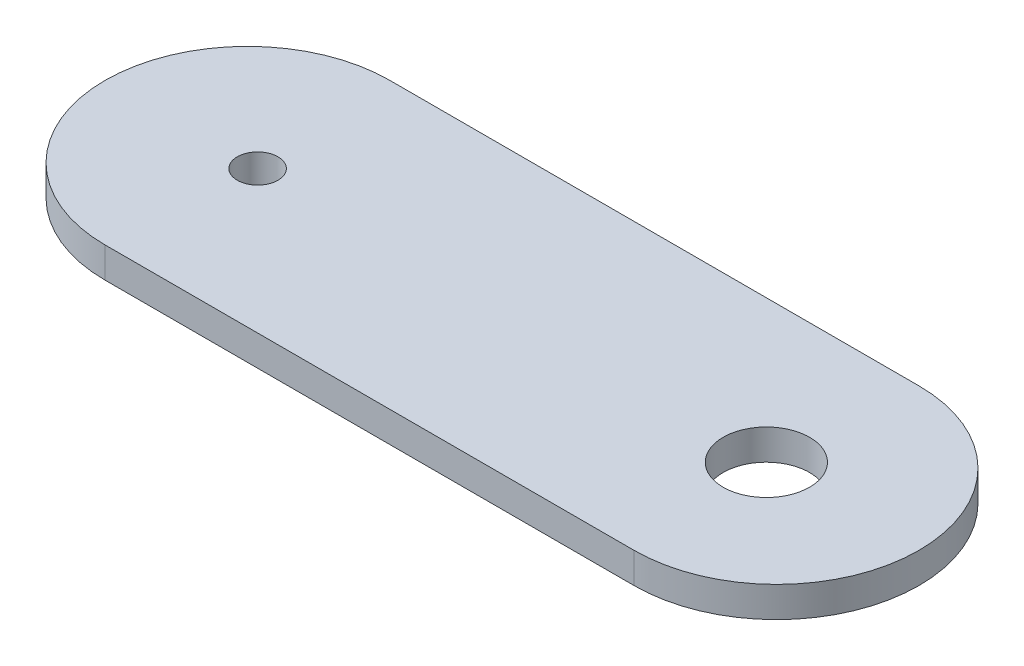
ISO-10303-21;
HEADER;
FILE_DESCRIPTION(('STEP AP214'),'2;1');
FILE_NAME('part.step','',(''),(''),'','','');
FILE_SCHEMA(('AUTOMOTIVE_DESIGN { 1 0 10303 214 1 1 1 1 }'));
ENDSEC;
DATA;
#1=APPLICATION_CONTEXT('core data for automotive mechanical design processes');
#2=APPLICATION_PROTOCOL_DEFINITION('international standard','automotive_design',2000,#1);
#3=PRODUCT_CONTEXT('',#1,'mechanical');
#4=PRODUCT('Part','Part','',(#3));
#5=PRODUCT_RELATED_PRODUCT_CATEGORY('part','',(#4));
#6=PRODUCT_DEFINITION_FORMATION('','',#4);
#7=PRODUCT_DEFINITION_CONTEXT('part definition',#1,'design');
#8=PRODUCT_DEFINITION('design','',#6,#7);
#9=PRODUCT_DEFINITION_SHAPE('','',#8);
#10=(LENGTH_UNIT() NAMED_UNIT(*) SI_UNIT(.MILLI.,.METRE.));
#11=(NAMED_UNIT(*) PLANE_ANGLE_UNIT() SI_UNIT($,.RADIAN.));
#12=(NAMED_UNIT(*) SI_UNIT($,.STERADIAN.) SOLID_ANGLE_UNIT());
#13=UNCERTAINTY_MEASURE_WITH_UNIT(LENGTH_MEASURE(1.E-05),#10,'distance_accuracy_value','');
#14=(GEOMETRIC_REPRESENTATION_CONTEXT(3) GLOBAL_UNCERTAINTY_ASSIGNED_CONTEXT((#13)) GLOBAL_UNIT_ASSIGNED_CONTEXT((#10,
#11,#12)) REPRESENTATION_CONTEXT('',''));
#15=CARTESIAN_POINT('',(0.,0.,0.));
#16=DIRECTION('',(0.,0.,1.));
#17=DIRECTION('',(1.,0.,0.));
#18=AXIS2_PLACEMENT_3D('',#15,#16,#17);
#19=CARTESIAN_POINT('',(26.,3.,0.));
#20=DIRECTION('',(0.,-1.,0.));
#21=DIRECTION('',(0.,0.,-1.));
#22=AXIS2_PLACEMENT_3D('',#19,#20,#21);
#23=CYLINDRICAL_SURFACE('',#22,14.);
#24=DIRECTION('',(0.,-1.,0.));
#25=VECTOR('',#24,1.);
#26=CARTESIAN_POINT('',(26.,3.,-14.));
#27=LINE('',#26,#25);
#28=CARTESIAN_POINT('',(26.,3.,-14.));
#29=VERTEX_POINT('',#28);
#30=CARTESIAN_POINT('',(26.,0.,-14.));
#31=VERTEX_POINT('',#30);
#32=EDGE_CURVE('E77',#29,#31,#27,.T.);
#33=ORIENTED_EDGE('',*,*,#32,.F.);
#34=CARTESIAN_POINT('',(26.,3.,0.));
#35=DIRECTION('',(0.,1.,0.));
#36=DIRECTION('',(0.,0.,1.));
#37=AXIS2_PLACEMENT_3D('',#34,#35,#36);
#38=CIRCLE('',#37,14.);
#39=CARTESIAN_POINT('',(26.,3.,14.));
#40=VERTEX_POINT('',#39);
#41=EDGE_CURVE('E40',#40,#29,#38,.T.);
#42=ORIENTED_EDGE('',*,*,#41,.F.);
#43=DIRECTION('',(0.,-1.,0.));
#44=VECTOR('',#43,1.);
#45=CARTESIAN_POINT('',(26.,3.,14.));
#46=LINE('',#45,#44);
#47=CARTESIAN_POINT('',(26.,0.,14.));
#48=VERTEX_POINT('',#47);
#49=EDGE_CURVE('E103',#48,#40,#46,.F.);
#50=ORIENTED_EDGE('',*,*,#49,.F.);
#51=CARTESIAN_POINT('',(26.,0.,0.));
#52=DIRECTION('',(0.,1.,0.));
#53=DIRECTION('',(0.,0.,1.));
#54=AXIS2_PLACEMENT_3D('',#51,#52,#53);
#55=CIRCLE('',#54,14.);
#56=EDGE_CURVE('E11',#31,#48,#55,.F.);
#57=ORIENTED_EDGE('',*,*,#56,.F.);
#58=EDGE_LOOP('',(#33,#42,#50,#57));
#59=FACE_BOUND('',#58,.T.);
#60=ADVANCED_FACE('F33',(#59),#23,.T.);
#61=CARTESIAN_POINT('',(-26.,0.,0.));
#62=DIRECTION('',(0.,-1.,0.));
#63=DIRECTION('',(0.,0.,-1.));
#64=AXIS2_PLACEMENT_3D('',#61,#62,#63);
#65=CYLINDRICAL_SURFACE('',#64,14.);
#66=DIRECTION('',(0.,-1.,0.));
#67=VECTOR('',#66,1.);
#68=CARTESIAN_POINT('',(-26.,3.,-14.));
#69=LINE('',#68,#67);
#70=CARTESIAN_POINT('',(-26.,0.,-14.));
#71=VERTEX_POINT('',#70);
#72=CARTESIAN_POINT('',(-26.,3.,-14.));
#73=VERTEX_POINT('',#72);
#74=EDGE_CURVE('E76',#71,#73,#69,.F.);
#75=ORIENTED_EDGE('',*,*,#74,.F.);
#76=CARTESIAN_POINT('',(-26.,0.,0.));
#77=DIRECTION('',(0.,1.,0.));
#78=DIRECTION('',(0.,0.,1.));
#79=AXIS2_PLACEMENT_3D('',#76,#77,#78);
#80=CIRCLE('',#79,14.);
#81=CARTESIAN_POINT('',(-26.,0.,14.));
#82=VERTEX_POINT('',#81);
#83=EDGE_CURVE('E81',#82,#71,#80,.F.);
#84=ORIENTED_EDGE('',*,*,#83,.F.);
#85=DIRECTION('',(0.,-1.,0.));
#86=VECTOR('',#85,1.);
#87=CARTESIAN_POINT('',(-26.,3.,14.));
#88=LINE('',#87,#86);
#89=CARTESIAN_POINT('',(-26.,3.,14.));
#90=VERTEX_POINT('',#89);
#91=EDGE_CURVE('E89',#90,#82,#88,.T.);
#92=ORIENTED_EDGE('',*,*,#91,.F.);
#93=CARTESIAN_POINT('',(-26.,3.,0.));
#94=DIRECTION('',(0.,1.,0.));
#95=DIRECTION('',(0.,0.,1.));
#96=AXIS2_PLACEMENT_3D('',#93,#94,#95);
#97=CIRCLE('',#96,14.);
#98=EDGE_CURVE('E88',#73,#90,#97,.T.);
#99=ORIENTED_EDGE('',*,*,#98,.F.);
#100=EDGE_LOOP('',(#75,#84,#92,#99));
#101=FACE_BOUND('',#100,.T.);
#102=ADVANCED_FACE('F92',(#101),#65,.T.);
#103=CARTESIAN_POINT('',(0.,3.,0.));
#104=DIRECTION('',(0.,1.,0.));
#105=DIRECTION('',(0.,0.,1.));
#106=AXIS2_PLACEMENT_3D('',#103,#104,#105);
#107=PLANE('',#106);
#108=CARTESIAN_POINT('',(25.,3.,0.));
#109=DIRECTION('',(0.,1.,0.));
#110=DIRECTION('',(0.,0.,1.));
#111=AXIS2_PLACEMENT_3D('',#108,#109,#110);
#112=CIRCLE('',#111,4.25000000000001);
#113=CARTESIAN_POINT('',(25.,3.,4.25000000000001));
#114=VERTEX_POINT('',#113);
#115=EDGE_CURVE('E79',#114,#114,#112,.T.);
#116=ORIENTED_EDGE('',*,*,#115,.F.);
#117=EDGE_LOOP('',(#116));
#118=FACE_BOUND('',#117,.T.);
#119=DIRECTION('',(1.,0.,0.));
#120=VECTOR('',#119,1.);
#121=CARTESIAN_POINT('',(-40.,3.,14.));
#122=LINE('',#121,#120);
#123=EDGE_CURVE('E93',#90,#40,#122,.T.);
#124=ORIENTED_EDGE('',*,*,#123,.T.);
#125=ORIENTED_EDGE('',*,*,#41,.T.);
#126=DIRECTION('',(-1.,0.,0.));
#127=VECTOR('',#126,1.);
#128=CARTESIAN_POINT('',(-40.,3.,-14.));
#129=LINE('',#128,#127);
#130=EDGE_CURVE('E97',#29,#73,#129,.T.);
#131=ORIENTED_EDGE('',*,*,#130,.T.);
#132=ORIENTED_EDGE('',*,*,#98,.T.);
#133=EDGE_LOOP('',(#124,#125,#131,#132));
#134=FACE_BOUND('',#133,.T.);
#135=CARTESIAN_POINT('',(-25.,3.,0.));
#136=DIRECTION('',(0.,1.,0.));
#137=DIRECTION('',(0.,0.,1.));
#138=AXIS2_PLACEMENT_3D('',#135,#136,#137);
#139=CIRCLE('',#138,2.);
#140=CARTESIAN_POINT('',(-25.,3.,2.));
#141=VERTEX_POINT('',#140);
#142=EDGE_CURVE('E113',#141,#141,#139,.T.);
#143=ORIENTED_EDGE('',*,*,#142,.F.);
#144=EDGE_LOOP('',(#143));
#145=FACE_BOUND('',#144,.T.);
#146=ADVANCED_FACE('F105',(#118,#134,#145),#107,.T.);
#147=CARTESIAN_POINT('',(0.,0.,0.));
#148=DIRECTION('',(0.,1.,0.));
#149=DIRECTION('',(0.,0.,1.));
#150=AXIS2_PLACEMENT_3D('',#147,#148,#149);
#151=PLANE('',#150);
#152=CARTESIAN_POINT('',(25.,0.,0.));
#153=DIRECTION('',(0.,1.,0.));
#154=DIRECTION('',(0.,0.,1.));
#155=AXIS2_PLACEMENT_3D('',#152,#153,#154);
#156=CIRCLE('',#155,4.25000000000001);
#157=CARTESIAN_POINT('',(25.,0.,4.25000000000001));
#158=VERTEX_POINT('',#157);
#159=EDGE_CURVE('E110',#158,#158,#156,.T.);
#160=ORIENTED_EDGE('',*,*,#159,.T.);
#161=EDGE_LOOP('',(#160));
#162=FACE_BOUND('',#161,.T.);
#163=DIRECTION('',(-1.,0.,0.));
#164=VECTOR('',#163,1.);
#165=CARTESIAN_POINT('',(-40.,0.,-14.));
#166=LINE('',#165,#164);
#167=EDGE_CURVE('E71',#31,#71,#166,.T.);
#168=ORIENTED_EDGE('',*,*,#167,.F.);
#169=ORIENTED_EDGE('',*,*,#56,.T.);
#170=DIRECTION('',(1.,0.,0.));
#171=VECTOR('',#170,1.);
#172=CARTESIAN_POINT('',(-40.,0.,14.));
#173=LINE('',#172,#171);
#174=EDGE_CURVE('E78',#82,#48,#173,.T.);
#175=ORIENTED_EDGE('',*,*,#174,.F.);
#176=ORIENTED_EDGE('',*,*,#83,.T.);
#177=EDGE_LOOP('',(#168,#169,#175,#176));
#178=FACE_BOUND('',#177,.T.);
#179=CARTESIAN_POINT('',(-25.,0.,0.));
#180=DIRECTION('',(0.,1.,0.));
#181=DIRECTION('',(0.,0.,1.));
#182=AXIS2_PLACEMENT_3D('',#179,#180,#181);
#183=CIRCLE('',#182,2.);
#184=CARTESIAN_POINT('',(-25.,0.,2.));
#185=VERTEX_POINT('',#184);
#186=EDGE_CURVE('E116',#185,#185,#183,.T.);
#187=ORIENTED_EDGE('',*,*,#186,.T.);
#188=EDGE_LOOP('',(#187));
#189=FACE_BOUND('',#188,.T.);
#190=ADVANCED_FACE('F82',(#162,#178,#189),#151,.F.);
#191=CARTESIAN_POINT('',(-40.,3.,-14.));
#192=DIRECTION('',(0.,0.,1.));
#193=DIRECTION('',(1.,0.,0.));
#194=AXIS2_PLACEMENT_3D('',#191,#192,#193);
#195=PLANE('',#194);
#196=ORIENTED_EDGE('',*,*,#130,.F.);
#197=ORIENTED_EDGE('',*,*,#32,.T.);
#198=ORIENTED_EDGE('',*,*,#167,.T.);
#199=ORIENTED_EDGE('',*,*,#74,.T.);
#200=EDGE_LOOP('',(#196,#197,#198,#199));
#201=FACE_BOUND('',#200,.T.);
#202=ADVANCED_FACE('F74',(#201),#195,.F.);
#203=CARTESIAN_POINT('',(-40.,3.,14.));
#204=DIRECTION('',(0.,0.,-1.));
#205=DIRECTION('',(-1.,0.,0.));
#206=AXIS2_PLACEMENT_3D('',#203,#204,#205);
#207=PLANE('',#206);
#208=ORIENTED_EDGE('',*,*,#174,.T.);
#209=ORIENTED_EDGE('',*,*,#49,.T.);
#210=ORIENTED_EDGE('',*,*,#123,.F.);
#211=ORIENTED_EDGE('',*,*,#91,.T.);
#212=EDGE_LOOP('',(#208,#209,#210,#211));
#213=FACE_BOUND('',#212,.T.);
#214=ADVANCED_FACE('F152',(#213),#207,.F.);
#215=CARTESIAN_POINT('',(25.,3.,0.));
#216=DIRECTION('',(0.,-1.,0.));
#217=DIRECTION('',(0.,0.,-1.));
#218=AXIS2_PLACEMENT_3D('',#215,#216,#217);
#219=CYLINDRICAL_SURFACE('',#218,4.25000000000001);
#220=ORIENTED_EDGE('',*,*,#115,.T.);
#221=EDGE_LOOP('',(#220));
#222=FACE_BOUND('',#221,.T.);
#223=ORIENTED_EDGE('',*,*,#159,.F.);
#224=EDGE_LOOP('',(#223));
#225=FACE_BOUND('',#224,.T.);
#226=ADVANCED_FACE('F145',(#222,#225),#219,.F.);
#227=CARTESIAN_POINT('',(-25.,3.,0.));
#228=DIRECTION('',(0.,-1.,0.));
#229=DIRECTION('',(0.,0.,-1.));
#230=AXIS2_PLACEMENT_3D('',#227,#228,#229);
#231=CYLINDRICAL_SURFACE('',#230,2.);
#232=ORIENTED_EDGE('',*,*,#142,.T.);
#233=EDGE_LOOP('',(#232));
#234=FACE_BOUND('',#233,.T.);
#235=ORIENTED_EDGE('',*,*,#186,.F.);
#236=EDGE_LOOP('',(#235));
#237=FACE_BOUND('',#236,.T.);
#238=ADVANCED_FACE('F122',(#234,#237),#231,.F.);
#239=CLOSED_SHELL('',(#60,#102,#146,#190,#202,#214,#226,#238));
#240=MANIFOLD_SOLID_BREP('B2',#239);
#241=ADVANCED_BREP_SHAPE_REPRESENTATION('',(#18,#240),#14);
#242=SHAPE_DEFINITION_REPRESENTATION(#9,#241);
ENDSEC;
END-ISO-10303-21;
